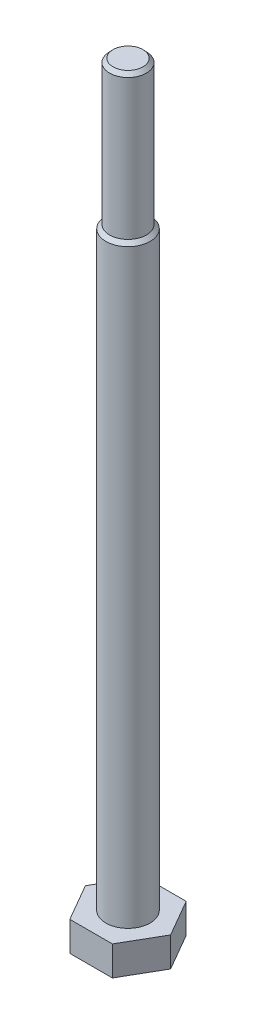
ISO-10303-21;
HEADER;
FILE_DESCRIPTION(('STEP AP214'),'2;1');
FILE_NAME('part.step','',(''),(''),'','','');
FILE_SCHEMA(('AUTOMOTIVE_DESIGN { 1 0 10303 214 1 1 1 1 }'));
ENDSEC;
DATA;
#1=APPLICATION_CONTEXT('core data for automotive mechanical design processes');
#2=APPLICATION_PROTOCOL_DEFINITION('international standard','automotive_design',2000,#1);
#3=PRODUCT_CONTEXT('',#1,'mechanical');
#4=PRODUCT('Part','Part','',(#3));
#5=PRODUCT_RELATED_PRODUCT_CATEGORY('part','',(#4));
#6=PRODUCT_DEFINITION_FORMATION('','',#4);
#7=PRODUCT_DEFINITION_CONTEXT('part definition',#1,'design');
#8=PRODUCT_DEFINITION('design','',#6,#7);
#9=PRODUCT_DEFINITION_SHAPE('','',#8);
#10=(LENGTH_UNIT() NAMED_UNIT(*) SI_UNIT(.MILLI.,.METRE.));
#11=(NAMED_UNIT(*) PLANE_ANGLE_UNIT() SI_UNIT($,.RADIAN.));
#12=(NAMED_UNIT(*) SI_UNIT($,.STERADIAN.) SOLID_ANGLE_UNIT());
#13=UNCERTAINTY_MEASURE_WITH_UNIT(LENGTH_MEASURE(1.E-05),#10,'distance_accuracy_value','');
#14=(GEOMETRIC_REPRESENTATION_CONTEXT(3) GLOBAL_UNCERTAINTY_ASSIGNED_CONTEXT((#13)) GLOBAL_UNIT_ASSIGNED_CONTEXT((#10,
#11,#12)) REPRESENTATION_CONTEXT('',''));
#15=CARTESIAN_POINT('',(0.,0.,0.));
#16=DIRECTION('',(0.,0.,1.));
#17=DIRECTION('',(1.,0.,0.));
#18=AXIS2_PLACEMENT_3D('',#15,#16,#17);
#19=CARTESIAN_POINT('',(2.88675134594819,4.,4.99999999999997));
#20=DIRECTION('',(-0.866025403784442,0.,-0.499999999999995));
#21=DIRECTION('',(-0.499999999999995,0.,0.866025403784442));
#22=AXIS2_PLACEMENT_3D('',#19,#20,#21);
#23=PLANE('',#22);
#24=DIRECTION('',(0.499999999999995,0.,-0.866025403784442));
#25=VECTOR('',#24,1.);
#26=CARTESIAN_POINT('',(2.88675134594819,0.,4.99999999999997));
#27=LINE('',#26,#25);
#28=CARTESIAN_POINT('',(2.88675134594819,0.,4.99999999999997));
#29=VERTEX_POINT('',#28);
#30=CARTESIAN_POINT('',(5.77350269189626,0.,0.));
#31=VERTEX_POINT('',#30);
#32=EDGE_CURVE('E120',#29,#31,#27,.T.);
#33=ORIENTED_EDGE('',*,*,#32,.T.);
#34=DIRECTION('',(0.,-1.,0.));
#35=VECTOR('',#34,1.);
#36=CARTESIAN_POINT('',(5.77350269189626,4.,0.));
#37=LINE('',#36,#35);
#38=CARTESIAN_POINT('',(5.77350269189626,4.,0.));
#39=VERTEX_POINT('',#38);
#40=EDGE_CURVE('E37',#39,#31,#37,.T.);
#41=ORIENTED_EDGE('',*,*,#40,.F.);
#42=DIRECTION('',(0.499999999999995,0.,-0.866025403784442));
#43=VECTOR('',#42,1.);
#44=CARTESIAN_POINT('',(2.88675134594819,4.,4.99999999999997));
#45=LINE('',#44,#43);
#46=CARTESIAN_POINT('',(2.88675134594819,4.,4.99999999999997));
#47=VERTEX_POINT('',#46);
#48=EDGE_CURVE('E131',#47,#39,#45,.T.);
#49=ORIENTED_EDGE('',*,*,#48,.F.);
#50=DIRECTION('',(0.,-1.,0.));
#51=VECTOR('',#50,1.);
#52=CARTESIAN_POINT('',(2.88675134594819,4.,4.99999999999997));
#53=LINE('',#52,#51);
#54=EDGE_CURVE('E116',#47,#29,#53,.T.);
#55=ORIENTED_EDGE('',*,*,#54,.T.);
#56=EDGE_LOOP('',(#33,#41,#49,#55));
#57=FACE_BOUND('',#56,.T.);
#58=ADVANCED_FACE('F34',(#57),#23,.F.);
#59=CARTESIAN_POINT('',(5.77350269189626,4.,0.));
#60=DIRECTION('',(-0.866025403784438,0.,0.500000000000001));
#61=DIRECTION('',(0.500000000000001,0.,0.866025403784438));
#62=AXIS2_PLACEMENT_3D('',#59,#60,#61);
#63=PLANE('',#62);
#64=DIRECTION('',(-0.500000000000001,0.,-0.866025403784438));
#65=VECTOR('',#64,1.);
#66=CARTESIAN_POINT('',(5.77350269189626,0.,0.));
#67=LINE('',#66,#65);
#68=CARTESIAN_POINT('',(2.88675134594812,0.,-5.00000000000001));
#69=VERTEX_POINT('',#68);
#70=EDGE_CURVE('E123',#31,#69,#67,.T.);
#71=ORIENTED_EDGE('',*,*,#70,.T.);
#72=DIRECTION('',(0.,-1.,0.));
#73=VECTOR('',#72,1.);
#74=CARTESIAN_POINT('',(2.88675134594812,4.,-5.00000000000001));
#75=LINE('',#74,#73);
#76=CARTESIAN_POINT('',(2.88675134594812,4.,-5.00000000000001));
#77=VERTEX_POINT('',#76);
#78=EDGE_CURVE('E134',#77,#69,#75,.T.);
#79=ORIENTED_EDGE('',*,*,#78,.F.);
#80=DIRECTION('',(-0.500000000000001,0.,-0.866025403784438));
#81=VECTOR('',#80,1.);
#82=CARTESIAN_POINT('',(5.77350269189626,4.,0.));
#83=LINE('',#82,#81);
#84=EDGE_CURVE('E89',#39,#77,#83,.T.);
#85=ORIENTED_EDGE('',*,*,#84,.F.);
#86=ORIENTED_EDGE('',*,*,#40,.T.);
#87=EDGE_LOOP('',(#71,#79,#85,#86));
#88=FACE_BOUND('',#87,.T.);
#89=ADVANCED_FACE('F139',(#88),#63,.F.);
#90=CARTESIAN_POINT('',(2.88675134594812,4.,-5.00000000000001));
#91=DIRECTION('',(0.,0.,1.));
#92=DIRECTION('',(1.,0.,0.));
#93=AXIS2_PLACEMENT_3D('',#90,#91,#92);
#94=PLANE('',#93);
#95=DIRECTION('',(-1.,0.,0.));
#96=VECTOR('',#95,1.);
#97=CARTESIAN_POINT('',(2.88675134594812,0.,-5.00000000000001));
#98=LINE('',#97,#96);
#99=CARTESIAN_POINT('',(-2.88675134594815,0.,-4.99999999999999));
#100=VERTEX_POINT('',#99);
#101=EDGE_CURVE('E126',#69,#100,#98,.T.);
#102=ORIENTED_EDGE('',*,*,#101,.T.);
#103=DIRECTION('',(0.,-1.,0.));
#104=VECTOR('',#103,1.);
#105=CARTESIAN_POINT('',(-2.88675134594815,4.,-4.99999999999999));
#106=LINE('',#105,#104);
#107=CARTESIAN_POINT('',(-2.88675134594815,4.,-4.99999999999999));
#108=VERTEX_POINT('',#107);
#109=EDGE_CURVE('E111',#108,#100,#106,.T.);
#110=ORIENTED_EDGE('',*,*,#109,.F.);
#111=DIRECTION('',(-1.,0.,0.));
#112=VECTOR('',#111,1.);
#113=CARTESIAN_POINT('',(2.88675134594812,4.,-5.00000000000001));
#114=LINE('',#113,#112);
#115=EDGE_CURVE('E102',#77,#108,#114,.T.);
#116=ORIENTED_EDGE('',*,*,#115,.F.);
#117=ORIENTED_EDGE('',*,*,#78,.T.);
#118=EDGE_LOOP('',(#102,#110,#116,#117));
#119=FACE_BOUND('',#118,.T.);
#120=ADVANCED_FACE('F145',(#119),#94,.F.);
#121=CARTESIAN_POINT('',(-2.88675134594815,4.,-4.99999999999999));
#122=DIRECTION('',(0.866025403784442,0.,0.499999999999995));
#123=DIRECTION('',(0.499999999999995,0.,-0.866025403784442));
#124=AXIS2_PLACEMENT_3D('',#121,#122,#123);
#125=PLANE('',#124);
#126=DIRECTION('',(-0.499999999999995,0.,0.866025403784441));
#127=VECTOR('',#126,1.);
#128=CARTESIAN_POINT('',(-2.88675134594815,0.,-4.99999999999999));
#129=LINE('',#128,#127);
#130=CARTESIAN_POINT('',(-5.77350269189626,0.,0.));
#131=VERTEX_POINT('',#130);
#132=EDGE_CURVE('E110',#100,#131,#129,.T.);
#133=ORIENTED_EDGE('',*,*,#132,.T.);
#134=DIRECTION('',(0.,-1.,0.));
#135=VECTOR('',#134,1.);
#136=CARTESIAN_POINT('',(-5.77350269189626,4.,0.));
#137=LINE('',#136,#135);
#138=CARTESIAN_POINT('',(-5.77350269189626,4.,0.));
#139=VERTEX_POINT('',#138);
#140=EDGE_CURVE('E107',#139,#131,#137,.T.);
#141=ORIENTED_EDGE('',*,*,#140,.F.);
#142=DIRECTION('',(-0.499999999999995,0.,0.866025403784441));
#143=VECTOR('',#142,1.);
#144=CARTESIAN_POINT('',(-2.88675134594815,4.,-4.99999999999999));
#145=LINE('',#144,#143);
#146=EDGE_CURVE('E96',#108,#139,#145,.T.);
#147=ORIENTED_EDGE('',*,*,#146,.F.);
#148=ORIENTED_EDGE('',*,*,#109,.T.);
#149=EDGE_LOOP('',(#133,#141,#147,#148));
#150=FACE_BOUND('',#149,.T.);
#151=ADVANCED_FACE('F108',(#150),#125,.F.);
#152=CARTESIAN_POINT('',(-5.77350269189626,4.,0.));
#153=DIRECTION('',(0.866025403784435,0.,-0.500000000000007));
#154=DIRECTION('',(-0.500000000000007,0.,-0.866025403784435));
#155=AXIS2_PLACEMENT_3D('',#152,#153,#154);
#156=PLANE('',#155);
#157=DIRECTION('',(0.500000000000007,0.,0.866025403784435));
#158=VECTOR('',#157,1.);
#159=CARTESIAN_POINT('',(-5.77350269189626,0.,0.));
#160=LINE('',#159,#158);
#161=CARTESIAN_POINT('',(-2.88675134594809,0.,5.00000000000003));
#162=VERTEX_POINT('',#161);
#163=EDGE_CURVE('E74',#131,#162,#160,.T.);
#164=ORIENTED_EDGE('',*,*,#163,.T.);
#165=DIRECTION('',(0.,-1.,0.));
#166=VECTOR('',#165,1.);
#167=CARTESIAN_POINT('',(-2.88675134594809,4.,5.00000000000003));
#168=LINE('',#167,#166);
#169=CARTESIAN_POINT('',(-2.88675134594809,4.,5.00000000000003));
#170=VERTEX_POINT('',#169);
#171=EDGE_CURVE('E112',#170,#162,#168,.T.);
#172=ORIENTED_EDGE('',*,*,#171,.F.);
#173=DIRECTION('',(0.500000000000007,0.,0.866025403784435));
#174=VECTOR('',#173,1.);
#175=CARTESIAN_POINT('',(-5.77350269189626,4.,0.));
#176=LINE('',#175,#174);
#177=EDGE_CURVE('E100',#139,#170,#176,.T.);
#178=ORIENTED_EDGE('',*,*,#177,.F.);
#179=ORIENTED_EDGE('',*,*,#140,.T.);
#180=EDGE_LOOP('',(#164,#172,#178,#179));
#181=FACE_BOUND('',#180,.T.);
#182=ADVANCED_FACE('F114',(#181),#156,.F.);
#183=CARTESIAN_POINT('',(-2.88675134594809,4.,5.00000000000003));
#184=DIRECTION('',(0.,0.,-1.));
#185=DIRECTION('',(-1.,0.,0.));
#186=AXIS2_PLACEMENT_3D('',#183,#184,#185);
#187=PLANE('',#186);
#188=DIRECTION('',(1.,0.,0.));
#189=VECTOR('',#188,1.);
#190=CARTESIAN_POINT('',(-2.88675134594809,0.,5.00000000000003));
#191=LINE('',#190,#189);
#192=EDGE_CURVE('E80',#162,#29,#191,.T.);
#193=ORIENTED_EDGE('',*,*,#192,.T.);
#194=ORIENTED_EDGE('',*,*,#54,.F.);
#195=DIRECTION('',(1.,0.,0.));
#196=VECTOR('',#195,1.);
#197=CARTESIAN_POINT('',(-2.88675134594809,4.,5.00000000000003));
#198=LINE('',#197,#196);
#199=EDGE_CURVE('E51',#170,#47,#198,.T.);
#200=ORIENTED_EDGE('',*,*,#199,.F.);
#201=ORIENTED_EDGE('',*,*,#171,.T.);
#202=EDGE_LOOP('',(#193,#194,#200,#201));
#203=FACE_BOUND('',#202,.T.);
#204=ADVANCED_FACE('F171',(#203),#187,.F.);
#205=CARTESIAN_POINT('',(0.,4.,0.));
#206=DIRECTION('',(0.,1.,0.));
#207=DIRECTION('',(0.,0.,1.));
#208=AXIS2_PLACEMENT_3D('',#205,#206,#207);
#209=PLANE('',#208);
#210=CARTESIAN_POINT('',(0.,4.,0.));
#211=DIRECTION('',(0.,1.,0.));
#212=DIRECTION('',(0.,0.,1.));
#213=AXIS2_PLACEMENT_3D('',#210,#211,#212);
#214=CIRCLE('',#213,3.);
#215=CARTESIAN_POINT('',(0.,4.,3.));
#216=VERTEX_POINT('',#215);
#217=EDGE_CURVE('E11',#216,#216,#214,.T.);
#218=ORIENTED_EDGE('',*,*,#217,.F.);
#219=EDGE_LOOP('',(#218));
#220=FACE_BOUND('',#219,.T.);
#221=ORIENTED_EDGE('',*,*,#48,.T.);
#222=ORIENTED_EDGE('',*,*,#84,.T.);
#223=ORIENTED_EDGE('',*,*,#115,.T.);
#224=ORIENTED_EDGE('',*,*,#146,.T.);
#225=ORIENTED_EDGE('',*,*,#177,.T.);
#226=ORIENTED_EDGE('',*,*,#199,.T.);
#227=EDGE_LOOP('',(#221,#222,#223,#224,#225,#226));
#228=FACE_BOUND('',#227,.T.);
#229=ADVANCED_FACE('F98',(#220,#228),#209,.T.);
#230=CARTESIAN_POINT('',(0.,0.,0.));
#231=DIRECTION('',(0.,1.,0.));
#232=DIRECTION('',(0.,0.,1.));
#233=AXIS2_PLACEMENT_3D('',#230,#231,#232);
#234=PLANE('',#233);
#235=ORIENTED_EDGE('',*,*,#32,.F.);
#236=ORIENTED_EDGE('',*,*,#192,.F.);
#237=ORIENTED_EDGE('',*,*,#163,.F.);
#238=ORIENTED_EDGE('',*,*,#132,.F.);
#239=ORIENTED_EDGE('',*,*,#101,.F.);
#240=ORIENTED_EDGE('',*,*,#70,.F.);
#241=EDGE_LOOP('',(#235,#236,#237,#238,#239,#240));
#242=FACE_BOUND('',#241,.T.);
#243=ADVANCED_FACE('F144',(#242),#234,.F.);
#244=CARTESIAN_POINT('',(0.,104.,0.));
#245=DIRECTION('',(0.,-1.,0.));
#246=DIRECTION('',(0.,0.,-1.));
#247=AXIS2_PLACEMENT_3D('',#244,#245,#246);
#248=CYLINDRICAL_SURFACE('',#247,3.);
#249=CARTESIAN_POINT('',(0.,84.,0.));
#250=DIRECTION('',(0.,1.,0.));
#251=DIRECTION('',(0.,0.,1.));
#252=AXIS2_PLACEMENT_3D('',#249,#250,#251);
#253=CIRCLE('',#252,3.);
#254=CARTESIAN_POINT('',(0.,84.,3.));
#255=VERTEX_POINT('',#254);
#256=EDGE_CURVE('E157',#255,#255,#253,.T.);
#257=ORIENTED_EDGE('',*,*,#256,.F.);
#258=EDGE_LOOP('',(#257));
#259=FACE_BOUND('',#258,.T.);
#260=ORIENTED_EDGE('',*,*,#217,.T.);
#261=EDGE_LOOP('',(#260));
#262=FACE_BOUND('',#261,.T.);
#263=ADVANCED_FACE('F163',(#259,#262),#248,.T.);
#264=CARTESIAN_POINT('',(0.,103.5,0.));
#265=DIRECTION('',(0.,-1.,0.));
#266=DIRECTION('',(0.,0.,-1.));
#267=AXIS2_PLACEMENT_3D('',#264,#265,#266);
#268=CONICAL_SURFACE('',#267,2.5,0.757637354925517);
#269=CARTESIAN_POINT('',(0.,104.,0.));
#270=DIRECTION('',(0.,1.,0.));
#271=DIRECTION('',(0.,0.,1.));
#272=AXIS2_PLACEMENT_3D('',#269,#270,#271);
#273=CIRCLE('',#272,2.02701771571068);
#274=CARTESIAN_POINT('',(0.,104.,2.02701771571068));
#275=VERTEX_POINT('',#274);
#276=EDGE_CURVE('E124',#275,#275,#273,.T.);
#277=ORIENTED_EDGE('',*,*,#276,.F.);
#278=EDGE_LOOP('',(#277));
#279=FACE_BOUND('',#278,.T.);
#280=CARTESIAN_POINT('',(0.,103.5,0.));
#281=DIRECTION('',(0.,1.,0.));
#282=DIRECTION('',(0.,0.,1.));
#283=AXIS2_PLACEMENT_3D('',#280,#281,#282);
#284=CIRCLE('',#283,2.5);
#285=CARTESIAN_POINT('',(0.,103.5,2.5));
#286=VERTEX_POINT('',#285);
#287=EDGE_CURVE('E151',#286,#286,#284,.T.);
#288=ORIENTED_EDGE('',*,*,#287,.T.);
#289=EDGE_LOOP('',(#288));
#290=FACE_BOUND('',#289,.T.);
#291=ADVANCED_FACE('F166',(#279,#290),#268,.T.);
#292=CARTESIAN_POINT('',(0.,106.310945379066,0.));
#293=DIRECTION('',(0.,1.,0.));
#294=DIRECTION('',(0.,0.,1.));
#295=AXIS2_PLACEMENT_3D('',#292,#293,#294);
#296=CYLINDRICAL_SURFACE('',#295,2.5);
#297=ORIENTED_EDGE('',*,*,#287,.F.);
#298=EDGE_LOOP('',(#297));
#299=FACE_BOUND('',#298,.T.);
#300=CARTESIAN_POINT('',(0.,84.5,0.));
#301=DIRECTION('',(0.,1.,0.));
#302=DIRECTION('',(0.,0.,1.));
#303=AXIS2_PLACEMENT_3D('',#300,#301,#302);
#304=CIRCLE('',#303,2.5);
#305=CARTESIAN_POINT('',(0.,84.5,2.5));
#306=VERTEX_POINT('',#305);
#307=EDGE_CURVE('E154',#306,#306,#304,.T.);
#308=ORIENTED_EDGE('',*,*,#307,.T.);
#309=EDGE_LOOP('',(#308));
#310=FACE_BOUND('',#309,.T.);
#311=ADVANCED_FACE('F225',(#299,#310),#296,.T.);
#312=CARTESIAN_POINT('',(0.,84.,0.));
#313=DIRECTION('',(0.,-1.,0.));
#314=DIRECTION('',(0.,0.,-1.));
#315=AXIS2_PLACEMENT_3D('',#312,#313,#314);
#316=CONICAL_SURFACE('',#315,3.,0.785398163397448);
#317=ORIENTED_EDGE('',*,*,#307,.F.);
#318=EDGE_LOOP('',(#317));
#319=FACE_BOUND('',#318,.T.);
#320=ORIENTED_EDGE('',*,*,#256,.T.);
#321=EDGE_LOOP('',(#320));
#322=FACE_BOUND('',#321,.T.);
#323=ADVANCED_FACE('F161',(#319,#322),#316,.T.);
#324=CARTESIAN_POINT('',(0.,104.,0.));
#325=DIRECTION('',(0.,1.,0.));
#326=DIRECTION('',(0.,0.,1.));
#327=AXIS2_PLACEMENT_3D('',#324,#325,#326);
#328=PLANE('',#327);
#329=ORIENTED_EDGE('',*,*,#276,.T.);
#330=EDGE_LOOP('',(#329));
#331=FACE_BOUND('',#330,.T.);
#332=ADVANCED_FACE('F244',(#331),#328,.T.);
#333=CLOSED_SHELL('',(#58,#89,#120,#151,#182,#204,#229,#243,#263,#291,#311,#323,#332));
#334=MANIFOLD_SOLID_BREP('B2',#333);
#335=ADVANCED_BREP_SHAPE_REPRESENTATION('',(#18,#334),#14);
#336=SHAPE_DEFINITION_REPRESENTATION(#9,#335);
ENDSEC;
END-ISO-10303-21;
